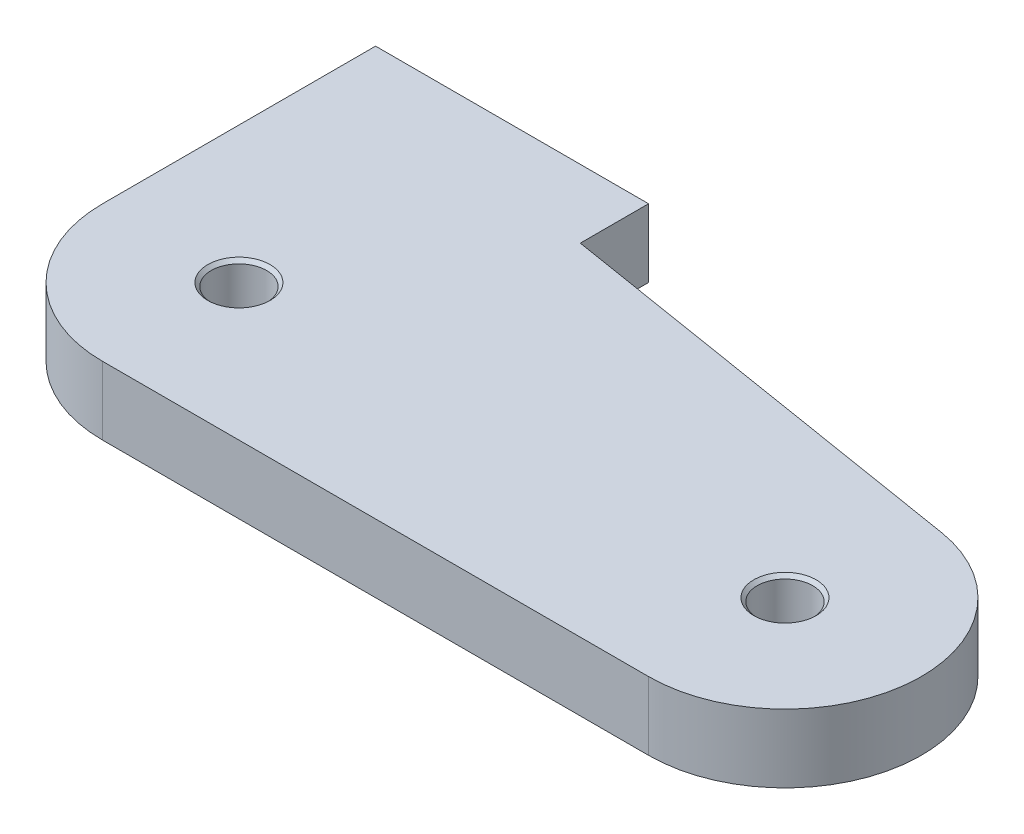
ISO-10303-21;
HEADER;
FILE_DESCRIPTION(('STEP AP214'),'2;1');
FILE_NAME('part.step','',(''),(''),'','','');
FILE_SCHEMA(('AUTOMOTIVE_DESIGN { 1 0 10303 214 1 1 1 1 }'));
ENDSEC;
DATA;
#1=APPLICATION_CONTEXT('core data for automotive mechanical design processes');
#2=APPLICATION_PROTOCOL_DEFINITION('international standard','automotive_design',2000,#1);
#3=PRODUCT_CONTEXT('',#1,'mechanical');
#4=PRODUCT('Part','Part','',(#3));
#5=PRODUCT_RELATED_PRODUCT_CATEGORY('part','',(#4));
#6=PRODUCT_DEFINITION_FORMATION('','',#4);
#7=PRODUCT_DEFINITION_CONTEXT('part definition',#1,'design');
#8=PRODUCT_DEFINITION('design','',#6,#7);
#9=PRODUCT_DEFINITION_SHAPE('','',#8);
#10=(LENGTH_UNIT() NAMED_UNIT(*) SI_UNIT(.MILLI.,.METRE.));
#11=(NAMED_UNIT(*) PLANE_ANGLE_UNIT() SI_UNIT($,.RADIAN.));
#12=(NAMED_UNIT(*) SI_UNIT($,.STERADIAN.) SOLID_ANGLE_UNIT());
#13=UNCERTAINTY_MEASURE_WITH_UNIT(LENGTH_MEASURE(1.E-05),#10,'distance_accuracy_value','');
#14=(GEOMETRIC_REPRESENTATION_CONTEXT(3) GLOBAL_UNCERTAINTY_ASSIGNED_CONTEXT((#13)) GLOBAL_UNIT_ASSIGNED_CONTEXT((#10,
#11,#12)) REPRESENTATION_CONTEXT('',''));
#15=CARTESIAN_POINT('',(0.,0.,0.));
#16=DIRECTION('',(0.,0.,1.));
#17=DIRECTION('',(1.,0.,0.));
#18=AXIS2_PLACEMENT_3D('',#15,#16,#17);
#19=CARTESIAN_POINT('',(0.,12.7,-25.3861982045828));
#20=DIRECTION('',(0.,-1.,0.));
#21=DIRECTION('',(0.,0.,-1.));
#22=AXIS2_PLACEMENT_3D('',#19,#20,#21);
#23=CYLINDRICAL_SURFACE('',#22,25.3861982045828);
#24=CARTESIAN_POINT('',(0.,0.,-25.3861982045828));
#25=DIRECTION('',(0.,1.,0.));
#26=DIRECTION('',(0.,0.,1.));
#27=AXIS2_PLACEMENT_3D('',#24,#25,#26);
#28=CIRCLE('',#27,25.3861982045828);
#29=CARTESIAN_POINT('',(-25.3861964436111,0.,-25.3956538243917));
#30=VERTEX_POINT('',#29);
#31=CARTESIAN_POINT('',(0.,0.,0.));
#32=VERTEX_POINT('',#31);
#33=EDGE_CURVE('E147',#30,#32,#28,.T.);
#34=ORIENTED_EDGE('',*,*,#33,.T.);
#35=DIRECTION('',(0.,-1.,0.));
#36=VECTOR('',#35,1.);
#37=CARTESIAN_POINT('',(0.,12.7,0.));
#38=LINE('',#37,#36);
#39=CARTESIAN_POINT('',(0.,12.7,0.));
#40=VERTEX_POINT('',#39);
#41=EDGE_CURVE('E11',#40,#32,#38,.T.);
#42=ORIENTED_EDGE('',*,*,#41,.F.);
#43=CARTESIAN_POINT('',(0.,12.7,-25.3861982045828));
#44=DIRECTION('',(0.,1.,0.));
#45=DIRECTION('',(0.,0.,1.));
#46=AXIS2_PLACEMENT_3D('',#43,#44,#45);
#47=CIRCLE('',#46,25.3861982045828);
#48=CARTESIAN_POINT('',(-25.3861964436111,12.7,-25.3956538243917));
#49=VERTEX_POINT('',#48);
#50=EDGE_CURVE('E167',#49,#40,#47,.T.);
#51=ORIENTED_EDGE('',*,*,#50,.F.);
#52=DIRECTION('',(0.,-1.,0.));
#53=VECTOR('',#52,1.);
#54=CARTESIAN_POINT('',(-25.3861964436111,12.7,-25.3956538243917));
#55=LINE('',#54,#53);
#56=EDGE_CURVE('E143',#49,#30,#55,.T.);
#57=ORIENTED_EDGE('',*,*,#56,.T.);
#58=EDGE_LOOP('',(#34,#42,#51,#57));
#59=FACE_BOUND('',#58,.T.);
#60=ADVANCED_FACE('F49',(#59),#23,.T.);
#61=CARTESIAN_POINT('',(0.,12.7,0.));
#62=DIRECTION('',(0.,0.,-1.));
#63=DIRECTION('',(-1.,0.,0.));
#64=AXIS2_PLACEMENT_3D('',#61,#62,#63);
#65=PLANE('',#64);
#66=DIRECTION('',(1.,0.,0.));
#67=VECTOR('',#66,1.);
#68=CARTESIAN_POINT('',(0.,0.,0.));
#69=LINE('',#68,#67);
#70=CARTESIAN_POINT('',(101.6,0.,0.));
#71=VERTEX_POINT('',#70);
#72=EDGE_CURVE('E151',#32,#71,#69,.T.);
#73=ORIENTED_EDGE('',*,*,#72,.T.);
#74=DIRECTION('',(0.,-1.,0.));
#75=VECTOR('',#74,1.);
#76=CARTESIAN_POINT('',(101.6,12.7,0.));
#77=LINE('',#76,#75);
#78=CARTESIAN_POINT('',(101.6,12.7,0.));
#79=VERTEX_POINT('',#78);
#80=EDGE_CURVE('E58',#79,#71,#77,.T.);
#81=ORIENTED_EDGE('',*,*,#80,.F.);
#82=DIRECTION('',(1.,0.,0.));
#83=VECTOR('',#82,1.);
#84=CARTESIAN_POINT('',(0.,12.7,0.));
#85=LINE('',#84,#83);
#86=EDGE_CURVE('E108',#40,#79,#85,.T.);
#87=ORIENTED_EDGE('',*,*,#86,.F.);
#88=ORIENTED_EDGE('',*,*,#41,.T.);
#89=EDGE_LOOP('',(#73,#81,#87,#88));
#90=FACE_BOUND('',#89,.T.);
#91=ADVANCED_FACE('F248',(#90),#65,.F.);
#92=CARTESIAN_POINT('',(101.6,12.7,-25.4));
#93=DIRECTION('',(0.,-1.,0.));
#94=DIRECTION('',(0.,0.,-1.));
#95=AXIS2_PLACEMENT_3D('',#92,#93,#94);
#96=CYLINDRICAL_SURFACE('',#95,25.4);
#97=CARTESIAN_POINT('',(101.6,0.,-25.4));
#98=DIRECTION('',(0.,1.,0.));
#99=DIRECTION('',(0.,0.,1.));
#100=AXIS2_PLACEMENT_3D('',#97,#98,#99);
#101=CIRCLE('',#100,25.4);
#102=CARTESIAN_POINT('',(105.669972302202,0.,-50.4718033946365));
#103=VERTEX_POINT('',#102);
#104=EDGE_CURVE('E155',#71,#103,#101,.T.);
#105=ORIENTED_EDGE('',*,*,#104,.T.);
#106=DIRECTION('',(0.,-1.,0.));
#107=VECTOR('',#106,1.);
#108=CARTESIAN_POINT('',(105.669972302202,12.7,-50.4718033946365));
#109=LINE('',#108,#107);
#110=CARTESIAN_POINT('',(105.669972302202,12.7,-50.4718033946365));
#111=VERTEX_POINT('',#110);
#112=EDGE_CURVE('E174',#111,#103,#109,.T.);
#113=ORIENTED_EDGE('',*,*,#112,.F.);
#114=CARTESIAN_POINT('',(101.6,12.7,-25.4));
#115=DIRECTION('',(0.,1.,0.));
#116=DIRECTION('',(0.,0.,1.));
#117=AXIS2_PLACEMENT_3D('',#114,#115,#116);
#118=CIRCLE('',#117,25.4);
#119=EDGE_CURVE('E184',#79,#111,#118,.T.);
#120=ORIENTED_EDGE('',*,*,#119,.F.);
#121=ORIENTED_EDGE('',*,*,#80,.T.);
#122=EDGE_LOOP('',(#105,#113,#120,#121));
#123=FACE_BOUND('',#122,.T.);
#124=ADVANCED_FACE('F182',(#123),#96,.T.);
#125=CARTESIAN_POINT('',(25.4138035563889,12.7,-63.5));
#126=DIRECTION('',(-0.160235130007969,0.,0.987078873804586));
#127=DIRECTION('',(0.987078873804586,0.,0.160235130007969));
#128=AXIS2_PLACEMENT_3D('',#125,#126,#127);
#129=PLANE('',#128);
#130=DIRECTION('',(-0.987078873804586,0.,-0.160235130007969));
#131=VECTOR('',#130,1.);
#132=CARTESIAN_POINT('',(25.4138035563889,0.,-63.5));
#133=LINE('',#132,#131);
#134=CARTESIAN_POINT('',(25.4138035563889,0.,-63.5));
#135=VERTEX_POINT('',#134);
#136=EDGE_CURVE('E158',#103,#135,#133,.T.);
#137=ORIENTED_EDGE('',*,*,#136,.T.);
#138=DIRECTION('',(0.,-1.,0.));
#139=VECTOR('',#138,1.);
#140=CARTESIAN_POINT('',(25.4138035563889,12.7,-63.5));
#141=LINE('',#140,#139);
#142=CARTESIAN_POINT('',(25.4138035563889,12.7,-63.5));
#143=VERTEX_POINT('',#142);
#144=EDGE_CURVE('E136',#143,#135,#141,.T.);
#145=ORIENTED_EDGE('',*,*,#144,.F.);
#146=DIRECTION('',(-0.987078873804586,0.,-0.160235130007969));
#147=VECTOR('',#146,1.);
#148=CARTESIAN_POINT('',(25.4138035563889,12.7,-63.5));
#149=LINE('',#148,#147);
#150=EDGE_CURVE('E125',#111,#143,#149,.T.);
#151=ORIENTED_EDGE('',*,*,#150,.F.);
#152=ORIENTED_EDGE('',*,*,#112,.T.);
#153=EDGE_LOOP('',(#137,#145,#151,#152));
#154=FACE_BOUND('',#153,.T.);
#155=ADVANCED_FACE('F190',(#154),#129,.F.);
#156=CARTESIAN_POINT('',(25.4138035563889,12.7,-76.2));
#157=DIRECTION('',(-1.,0.,0.));
#158=DIRECTION('',(0.,0.,1.));
#159=AXIS2_PLACEMENT_3D('',#156,#157,#158);
#160=PLANE('',#159);
#161=DIRECTION('',(0.,0.,-1.));
#162=VECTOR('',#161,1.);
#163=CARTESIAN_POINT('',(25.4138035563889,0.,-76.2));
#164=LINE('',#163,#162);
#165=CARTESIAN_POINT('',(25.4138035563889,0.,-76.2));
#166=VERTEX_POINT('',#165);
#167=EDGE_CURVE('E134',#135,#166,#164,.T.);
#168=ORIENTED_EDGE('',*,*,#167,.T.);
#169=DIRECTION('',(0.,-1.,0.));
#170=VECTOR('',#169,1.);
#171=CARTESIAN_POINT('',(25.4138035563889,12.7,-76.2));
#172=LINE('',#171,#170);
#173=CARTESIAN_POINT('',(25.4138035563889,12.7,-76.2));
#174=VERTEX_POINT('',#173);
#175=EDGE_CURVE('E131',#174,#166,#172,.T.);
#176=ORIENTED_EDGE('',*,*,#175,.F.);
#177=DIRECTION('',(0.,0.,-1.));
#178=VECTOR('',#177,1.);
#179=CARTESIAN_POINT('',(25.4138035563889,12.7,-76.2));
#180=LINE('',#179,#178);
#181=EDGE_CURVE('E119',#143,#174,#180,.T.);
#182=ORIENTED_EDGE('',*,*,#181,.F.);
#183=ORIENTED_EDGE('',*,*,#144,.T.);
#184=EDGE_LOOP('',(#168,#176,#182,#183));
#185=FACE_BOUND('',#184,.T.);
#186=ADVANCED_FACE('F132',(#185),#160,.F.);
#187=CARTESIAN_POINT('',(-25.3861964436111,12.7,-76.2));
#188=DIRECTION('',(0.,0.,1.));
#189=DIRECTION('',(1.,0.,0.));
#190=AXIS2_PLACEMENT_3D('',#187,#188,#189);
#191=PLANE('',#190);
#192=DIRECTION('',(-1.,0.,0.));
#193=VECTOR('',#192,1.);
#194=CARTESIAN_POINT('',(-25.3861964436111,0.,-76.2));
#195=LINE('',#194,#193);
#196=CARTESIAN_POINT('',(-25.3861964436111,0.,-76.2));
#197=VERTEX_POINT('',#196);
#198=EDGE_CURVE('E93',#166,#197,#195,.T.);
#199=ORIENTED_EDGE('',*,*,#198,.T.);
#200=DIRECTION('',(0.,-1.,0.));
#201=VECTOR('',#200,1.);
#202=CARTESIAN_POINT('',(-25.3861964436111,12.7,-76.2));
#203=LINE('',#202,#201);
#204=CARTESIAN_POINT('',(-25.3861964436111,12.7,-76.2));
#205=VERTEX_POINT('',#204);
#206=EDGE_CURVE('E137',#205,#197,#203,.T.);
#207=ORIENTED_EDGE('',*,*,#206,.F.);
#208=DIRECTION('',(-1.,0.,0.));
#209=VECTOR('',#208,1.);
#210=CARTESIAN_POINT('',(-25.3861964436111,12.7,-76.2));
#211=LINE('',#210,#209);
#212=EDGE_CURVE('E123',#174,#205,#211,.T.);
#213=ORIENTED_EDGE('',*,*,#212,.F.);
#214=ORIENTED_EDGE('',*,*,#175,.T.);
#215=EDGE_LOOP('',(#199,#207,#213,#214));
#216=FACE_BOUND('',#215,.T.);
#217=ADVANCED_FACE('F139',(#216),#191,.F.);
#218=CARTESIAN_POINT('',(-25.3861964436111,12.7,-25.3956538243917));
#219=DIRECTION('',(1.,0.,0.));
#220=DIRECTION('',(0.,0.,-1.));
#221=AXIS2_PLACEMENT_3D('',#218,#219,#220);
#222=PLANE('',#221);
#223=DIRECTION('',(0.,0.,1.));
#224=VECTOR('',#223,1.);
#225=CARTESIAN_POINT('',(-25.3861964436111,0.,-25.3956538243917));
#226=LINE('',#225,#224);
#227=EDGE_CURVE('E99',#197,#30,#226,.T.);
#228=ORIENTED_EDGE('',*,*,#227,.T.);
#229=ORIENTED_EDGE('',*,*,#56,.F.);
#230=DIRECTION('',(0.,0.,1.));
#231=VECTOR('',#230,1.);
#232=CARTESIAN_POINT('',(-25.3861964436111,12.7,-25.3956538243917));
#233=LINE('',#232,#231);
#234=EDGE_CURVE('E66',#205,#49,#233,.T.);
#235=ORIENTED_EDGE('',*,*,#234,.F.);
#236=ORIENTED_EDGE('',*,*,#206,.T.);
#237=EDGE_LOOP('',(#228,#229,#235,#236));
#238=FACE_BOUND('',#237,.T.);
#239=ADVANCED_FACE('F227',(#238),#222,.F.);
#240=CARTESIAN_POINT('',(0.,12.7,-25.3861982045828));
#241=DIRECTION('',(0.,1.,0.));
#242=DIRECTION('',(0.,0.,1.));
#243=AXIS2_PLACEMENT_3D('',#240,#241,#242);
#244=PLANE('',#243);
#245=CARTESIAN_POINT('',(0.,12.7,-25.3861982045828));
#246=DIRECTION('',(0.,1.,0.));
#247=DIRECTION('',(0.,0.,1.));
#248=AXIS2_PLACEMENT_3D('',#245,#246,#247);
#249=CIRCLE('',#248,5.794375);
#250=CARTESIAN_POINT('',(0.,12.7,-19.5918232045828));
#251=VERTEX_POINT('',#250);
#252=EDGE_CURVE('E218',#251,#251,#249,.T.);
#253=ORIENTED_EDGE('',*,*,#252,.F.);
#254=EDGE_LOOP('',(#253));
#255=FACE_BOUND('',#254,.T.);
#256=CARTESIAN_POINT('',(101.6,12.7,-25.4));
#257=DIRECTION('',(0.,1.,0.));
#258=DIRECTION('',(0.,0.,1.));
#259=AXIS2_PLACEMENT_3D('',#256,#257,#258);
#260=CIRCLE('',#259,5.794375);
#261=CARTESIAN_POINT('',(101.6,12.7,-19.605625));
#262=VERTEX_POINT('',#261);
#263=EDGE_CURVE('E206',#262,#262,#260,.T.);
#264=ORIENTED_EDGE('',*,*,#263,.F.);
#265=EDGE_LOOP('',(#264));
#266=FACE_BOUND('',#265,.T.);
#267=ORIENTED_EDGE('',*,*,#50,.T.);
#268=ORIENTED_EDGE('',*,*,#86,.T.);
#269=ORIENTED_EDGE('',*,*,#119,.T.);
#270=ORIENTED_EDGE('',*,*,#150,.T.);
#271=ORIENTED_EDGE('',*,*,#181,.T.);
#272=ORIENTED_EDGE('',*,*,#212,.T.);
#273=ORIENTED_EDGE('',*,*,#234,.T.);
#274=EDGE_LOOP('',(#267,#268,#269,#270,#271,#272,#273));
#275=FACE_BOUND('',#274,.T.);
#276=ADVANCED_FACE('F121',(#255,#266,#275),#244,.T.);
#277=CARTESIAN_POINT('',(0.,0.,-25.3861982045828));
#278=DIRECTION('',(0.,1.,0.));
#279=DIRECTION('',(0.,0.,1.));
#280=AXIS2_PLACEMENT_3D('',#277,#278,#279);
#281=PLANE('',#280);
#282=CARTESIAN_POINT('',(0.,0.,-25.3861982045828));
#283=DIRECTION('',(0.,1.,0.));
#284=DIRECTION('',(0.,0.,1.));
#285=AXIS2_PLACEMENT_3D('',#282,#283,#284);
#286=CIRCLE('',#285,5.159375);
#287=CARTESIAN_POINT('',(0.,0.,-20.2268232045828));
#288=VERTEX_POINT('',#287);
#289=EDGE_CURVE('E210',#288,#288,#286,.T.);
#290=ORIENTED_EDGE('',*,*,#289,.T.);
#291=EDGE_LOOP('',(#290));
#292=FACE_BOUND('',#291,.T.);
#293=CARTESIAN_POINT('',(101.6,0.,-25.4));
#294=DIRECTION('',(0.,1.,0.));
#295=DIRECTION('',(0.,0.,1.));
#296=AXIS2_PLACEMENT_3D('',#293,#294,#295);
#297=CIRCLE('',#296,5.15937499999999);
#298=CARTESIAN_POINT('',(101.6,0.,-20.240625));
#299=VERTEX_POINT('',#298);
#300=EDGE_CURVE('E152',#299,#299,#297,.T.);
#301=ORIENTED_EDGE('',*,*,#300,.T.);
#302=EDGE_LOOP('',(#301));
#303=FACE_BOUND('',#302,.T.);
#304=ORIENTED_EDGE('',*,*,#33,.F.);
#305=ORIENTED_EDGE('',*,*,#227,.F.);
#306=ORIENTED_EDGE('',*,*,#198,.F.);
#307=ORIENTED_EDGE('',*,*,#167,.F.);
#308=ORIENTED_EDGE('',*,*,#136,.F.);
#309=ORIENTED_EDGE('',*,*,#104,.F.);
#310=ORIENTED_EDGE('',*,*,#72,.F.);
#311=EDGE_LOOP('',(#304,#305,#306,#307,#308,#309,#310));
#312=FACE_BOUND('',#311,.T.);
#313=ADVANCED_FACE('F188',(#292,#303,#312),#281,.F.);
#314=CARTESIAN_POINT('',(101.6,12.7,-25.4));
#315=DIRECTION('',(0.,1.,0.));
#316=DIRECTION('',(0.,0.,1.));
#317=AXIS2_PLACEMENT_3D('',#314,#315,#316);
#318=CYLINDRICAL_SURFACE('',#317,5.15937499999999);
#319=ORIENTED_EDGE('',*,*,#300,.F.);
#320=EDGE_LOOP('',(#319));
#321=FACE_BOUND('',#320,.T.);
#322=CARTESIAN_POINT('',(101.6,12.065,-25.4));
#323=DIRECTION('',(0.,1.,0.));
#324=DIRECTION('',(0.,0.,1.));
#325=AXIS2_PLACEMENT_3D('',#322,#323,#324);
#326=CIRCLE('',#325,5.15937499999999);
#327=CARTESIAN_POINT('',(101.6,12.065,-20.240625));
#328=VERTEX_POINT('',#327);
#329=EDGE_CURVE('E202',#328,#328,#326,.T.);
#330=ORIENTED_EDGE('',*,*,#329,.T.);
#331=EDGE_LOOP('',(#330));
#332=FACE_BOUND('',#331,.T.);
#333=ADVANCED_FACE('F234',(#321,#332),#318,.F.);
#334=CARTESIAN_POINT('',(101.6,12.7,-25.4));
#335=DIRECTION('',(0.,1.,0.));
#336=DIRECTION('',(0.,0.,1.));
#337=AXIS2_PLACEMENT_3D('',#334,#335,#336);
#338=CONICAL_SURFACE('',#337,5.794375,0.785398163397457);
#339=ORIENTED_EDGE('',*,*,#329,.F.);
#340=EDGE_LOOP('',(#339));
#341=FACE_BOUND('',#340,.T.);
#342=ORIENTED_EDGE('',*,*,#263,.T.);
#343=EDGE_LOOP('',(#342));
#344=FACE_BOUND('',#343,.T.);
#345=ADVANCED_FACE('F231',(#341,#344),#338,.F.);
#346=CARTESIAN_POINT('',(0.,12.7,-25.3861982045828));
#347=DIRECTION('',(0.,1.,0.));
#348=DIRECTION('',(0.,0.,1.));
#349=AXIS2_PLACEMENT_3D('',#346,#347,#348);
#350=CYLINDRICAL_SURFACE('',#349,5.159375);
#351=ORIENTED_EDGE('',*,*,#289,.F.);
#352=EDGE_LOOP('',(#351));
#353=FACE_BOUND('',#352,.T.);
#354=CARTESIAN_POINT('',(0.,12.065,-25.3861982045828));
#355=DIRECTION('',(0.,1.,0.));
#356=DIRECTION('',(0.,0.,1.));
#357=AXIS2_PLACEMENT_3D('',#354,#355,#356);
#358=CIRCLE('',#357,5.159375);
#359=CARTESIAN_POINT('',(0.,12.065,-20.2268232045828));
#360=VERTEX_POINT('',#359);
#361=EDGE_CURVE('E214',#360,#360,#358,.T.);
#362=ORIENTED_EDGE('',*,*,#361,.T.);
#363=EDGE_LOOP('',(#362));
#364=FACE_BOUND('',#363,.T.);
#365=ADVANCED_FACE('F233',(#353,#364),#350,.F.);
#366=CARTESIAN_POINT('',(0.,12.7,-25.3861982045828));
#367=DIRECTION('',(0.,1.,0.));
#368=DIRECTION('',(0.,0.,1.));
#369=AXIS2_PLACEMENT_3D('',#366,#367,#368);
#370=CONICAL_SURFACE('',#369,5.794375,0.785398163397447);
#371=ORIENTED_EDGE('',*,*,#361,.F.);
#372=EDGE_LOOP('',(#371));
#373=FACE_BOUND('',#372,.T.);
#374=ORIENTED_EDGE('',*,*,#252,.T.);
#375=EDGE_LOOP('',(#374));
#376=FACE_BOUND('',#375,.T.);
#377=ADVANCED_FACE('F223',(#373,#376),#370,.F.);
#378=CLOSED_SHELL('',(#60,#91,#124,#155,#186,#217,#239,#276,#313,#333,#345,#365,#377));
#379=MANIFOLD_SOLID_BREP('B2',#378);
#380=ADVANCED_BREP_SHAPE_REPRESENTATION('',(#18,#379),#14);
#381=SHAPE_DEFINITION_REPRESENTATION(#9,#380);
ENDSEC;
END-ISO-10303-21;
